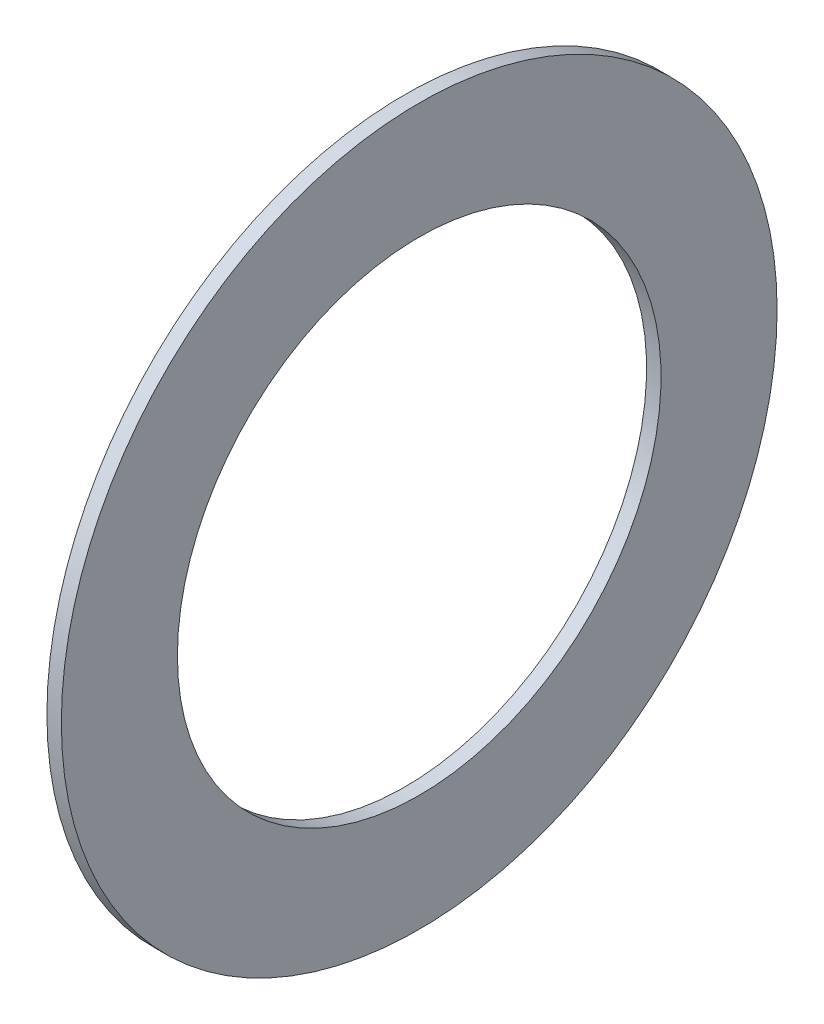
ISO-10303-21;
HEADER;
FILE_DESCRIPTION(('STEP AP214'),'2;1');
FILE_NAME('part.step','',(''),(''),'','','');
FILE_SCHEMA(('AUTOMOTIVE_DESIGN { 1 0 10303 214 1 1 1 1 }'));
ENDSEC;
DATA;
#1=APPLICATION_CONTEXT('core data for automotive mechanical design processes');
#2=APPLICATION_PROTOCOL_DEFINITION('international standard','automotive_design',2000,#1);
#3=PRODUCT_CONTEXT('',#1,'mechanical');
#4=PRODUCT('Part','Part','',(#3));
#5=PRODUCT_RELATED_PRODUCT_CATEGORY('part','',(#4));
#6=PRODUCT_DEFINITION_FORMATION('','',#4);
#7=PRODUCT_DEFINITION_CONTEXT('part definition',#1,'design');
#8=PRODUCT_DEFINITION('design','',#6,#7);
#9=PRODUCT_DEFINITION_SHAPE('','',#8);
#10=(LENGTH_UNIT() NAMED_UNIT(*) SI_UNIT(.MILLI.,.METRE.));
#11=(NAMED_UNIT(*) PLANE_ANGLE_UNIT() SI_UNIT($,.RADIAN.));
#12=(NAMED_UNIT(*) SI_UNIT($,.STERADIAN.) SOLID_ANGLE_UNIT());
#13=UNCERTAINTY_MEASURE_WITH_UNIT(LENGTH_MEASURE(1.E-05),#10,'distance_accuracy_value','');
#14=(GEOMETRIC_REPRESENTATION_CONTEXT(3) GLOBAL_UNCERTAINTY_ASSIGNED_CONTEXT((#13)) GLOBAL_UNIT_ASSIGNED_CONTEXT((#10,
#11,#12)) REPRESENTATION_CONTEXT('',''));
#15=CARTESIAN_POINT('',(0.,0.,0.));
#16=DIRECTION('',(0.,0.,1.));
#17=DIRECTION('',(1.,0.,0.));
#18=AXIS2_PLACEMENT_3D('',#15,#16,#17);
#19=CARTESIAN_POINT('',(2.9502,2.5,0.));
#20=DIRECTION('',(1.,0.,0.));
#21=DIRECTION('',(0.,0.,-1.));
#22=AXIS2_PLACEMENT_3D('',#19,#20,#21);
#23=PLANE('',#22);
#24=CARTESIAN_POINT('',(2.9502,0.,0.));
#25=DIRECTION('',(-1.,0.,0.));
#26=DIRECTION('',(0.,0.,1.));
#27=AXIS2_PLACEMENT_3D('',#24,#25,#26);
#28=CIRCLE('',#27,2.5);
#29=CARTESIAN_POINT('',(2.9502,0.,2.5));
#30=VERTEX_POINT('',#29);
#31=EDGE_CURVE('E17',#30,#30,#28,.T.);
#32=ORIENTED_EDGE('',*,*,#31,.T.);
#33=EDGE_LOOP('',(#32));
#34=FACE_BOUND('',#33,.T.);
#35=CARTESIAN_POINT('',(2.9502,0.,0.));
#36=DIRECTION('',(-1.,0.,0.));
#37=DIRECTION('',(0.,0.,1.));
#38=AXIS2_PLACEMENT_3D('',#35,#36,#37);
#39=CIRCLE('',#38,3.7);
#40=CARTESIAN_POINT('',(2.9502,0.,3.7));
#41=VERTEX_POINT('',#40);
#42=EDGE_CURVE('E26',#41,#41,#39,.T.);
#43=ORIENTED_EDGE('',*,*,#42,.F.);
#44=EDGE_LOOP('',(#43));
#45=FACE_BOUND('',#44,.T.);
#46=ADVANCED_FACE('F14',(#34,#45),#23,.T.);
#47=CARTESIAN_POINT('',(2.9502,0.,0.));
#48=DIRECTION('',(-1.,0.,0.));
#49=DIRECTION('',(0.,0.,1.));
#50=AXIS2_PLACEMENT_3D('',#47,#48,#49);
#51=CYLINDRICAL_SURFACE('',#50,2.5);
#52=CARTESIAN_POINT('',(2.8008,0.,0.));
#53=DIRECTION('',(-1.,0.,0.));
#54=DIRECTION('',(0.,0.,1.));
#55=AXIS2_PLACEMENT_3D('',#52,#53,#54);
#56=CIRCLE('',#55,2.5);
#57=CARTESIAN_POINT('',(2.8008,0.,2.5));
#58=VERTEX_POINT('',#57);
#59=EDGE_CURVE('E21',#58,#58,#56,.F.);
#60=ORIENTED_EDGE('',*,*,#59,.F.);
#61=EDGE_LOOP('',(#60));
#62=FACE_BOUND('',#61,.T.);
#63=ORIENTED_EDGE('',*,*,#31,.F.);
#64=EDGE_LOOP('',(#63));
#65=FACE_BOUND('',#64,.T.);
#66=ADVANCED_FACE('F36',(#62,#65),#51,.F.);
#67=CARTESIAN_POINT('',(2.9502,0.,0.));
#68=DIRECTION('',(-1.,0.,0.));
#69=DIRECTION('',(0.,0.,1.));
#70=AXIS2_PLACEMENT_3D('',#67,#68,#69);
#71=CYLINDRICAL_SURFACE('',#70,3.7);
#72=ORIENTED_EDGE('',*,*,#42,.T.);
#73=EDGE_LOOP('',(#72));
#74=FACE_BOUND('',#73,.T.);
#75=CARTESIAN_POINT('',(2.8008,0.,0.));
#76=DIRECTION('',(-1.,0.,0.));
#77=DIRECTION('',(0.,0.,1.));
#78=AXIS2_PLACEMENT_3D('',#75,#76,#77);
#79=CIRCLE('',#78,3.7);
#80=CARTESIAN_POINT('',(2.8008,0.,3.7));
#81=VERTEX_POINT('',#80);
#82=EDGE_CURVE('E10',#81,#81,#79,.T.);
#83=ORIENTED_EDGE('',*,*,#82,.F.);
#84=EDGE_LOOP('',(#83));
#85=FACE_BOUND('',#84,.T.);
#86=ADVANCED_FACE('F38',(#74,#85),#71,.T.);
#87=CARTESIAN_POINT('',(2.8008,3.7,0.));
#88=DIRECTION('',(-1.,0.,0.));
#89=DIRECTION('',(0.,0.,1.));
#90=AXIS2_PLACEMENT_3D('',#87,#88,#89);
#91=PLANE('',#90);
#92=ORIENTED_EDGE('',*,*,#82,.T.);
#93=EDGE_LOOP('',(#92));
#94=FACE_BOUND('',#93,.T.);
#95=ORIENTED_EDGE('',*,*,#59,.T.);
#96=EDGE_LOOP('',(#95));
#97=FACE_BOUND('',#96,.T.);
#98=ADVANCED_FACE('F45',(#94,#97),#91,.T.);
#99=CLOSED_SHELL('',(#46,#66,#86,#98));
#100=MANIFOLD_SOLID_BREP('B1',#99);
#101=ADVANCED_BREP_SHAPE_REPRESENTATION('',(#18,#100),#14);
#102=SHAPE_DEFINITION_REPRESENTATION(#9,#101);
ENDSEC;
END-ISO-10303-21;
